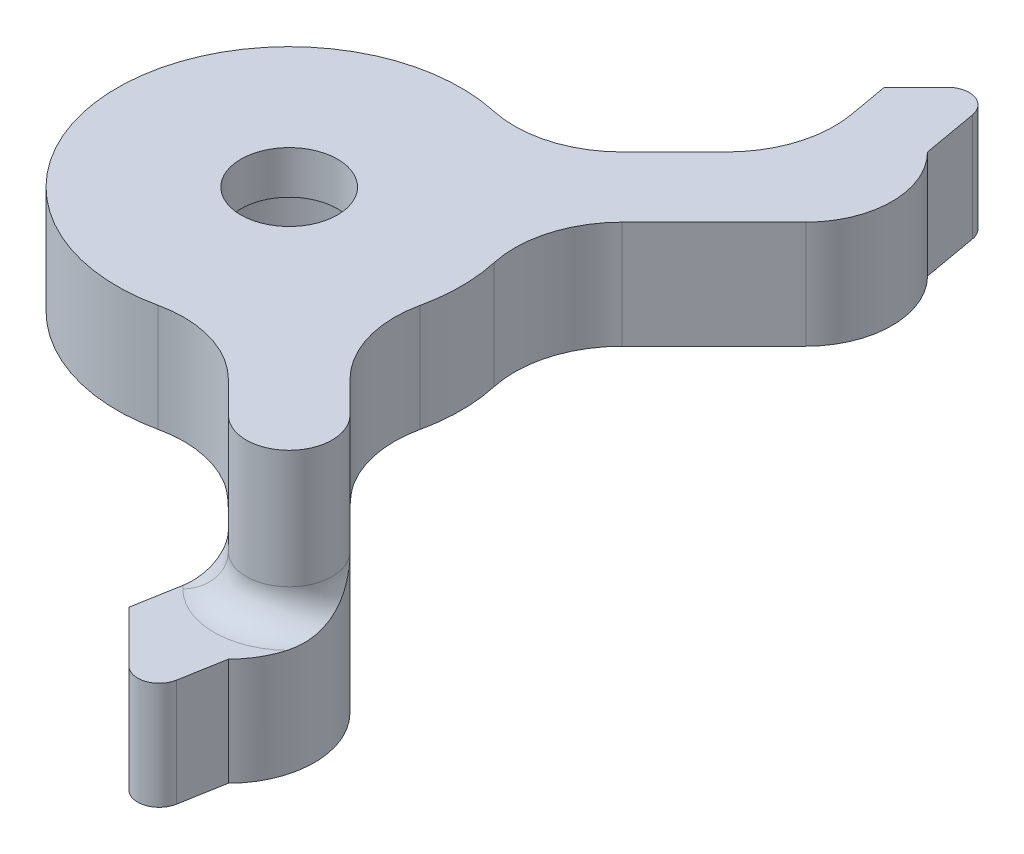
ISO-10303-21;
HEADER;
FILE_DESCRIPTION(('STEP AP214'),'2;1');
FILE_NAME('part.step','',(''),(''),'','','');
FILE_SCHEMA(('AUTOMOTIVE_DESIGN { 1 0 10303 214 1 1 1 1 }'));
ENDSEC;
DATA;
#1=APPLICATION_CONTEXT('core data for automotive mechanical design processes');
#2=APPLICATION_PROTOCOL_DEFINITION('international standard','automotive_design',2000,#1);
#3=PRODUCT_CONTEXT('',#1,'mechanical');
#4=PRODUCT('Part','Part','',(#3));
#5=PRODUCT_RELATED_PRODUCT_CATEGORY('part','',(#4));
#6=PRODUCT_DEFINITION_FORMATION('','',#4);
#7=PRODUCT_DEFINITION_CONTEXT('part definition',#1,'design');
#8=PRODUCT_DEFINITION('design','',#6,#7);
#9=PRODUCT_DEFINITION_SHAPE('','',#8);
#10=(LENGTH_UNIT() NAMED_UNIT(*) SI_UNIT(.MILLI.,.METRE.));
#11=(NAMED_UNIT(*) PLANE_ANGLE_UNIT() SI_UNIT($,.RADIAN.));
#12=(NAMED_UNIT(*) SI_UNIT($,.STERADIAN.) SOLID_ANGLE_UNIT());
#13=UNCERTAINTY_MEASURE_WITH_UNIT(LENGTH_MEASURE(1.E-05),#10,'distance_accuracy_value','');
#14=(GEOMETRIC_REPRESENTATION_CONTEXT(3) GLOBAL_UNCERTAINTY_ASSIGNED_CONTEXT((#13)) GLOBAL_UNIT_ASSIGNED_CONTEXT((#10,
#11,#12)) REPRESENTATION_CONTEXT('',''));
#15=CARTESIAN_POINT('',(0.,0.,0.));
#16=DIRECTION('',(0.,0.,1.));
#17=DIRECTION('',(1.,0.,0.));
#18=AXIS2_PLACEMENT_3D('',#15,#16,#17);
#19=CARTESIAN_POINT('',(0.,5.,0.));
#20=DIRECTION('',(0.,-1.,0.));
#21=DIRECTION('',(0.,0.,-1.));
#22=AXIS2_PLACEMENT_3D('',#19,#20,#21);
#23=CYLINDRICAL_SURFACE('',#22,8.);
#24=CARTESIAN_POINT('',(0.,0.,0.));
#25=DIRECTION('',(0.,1.,0.));
#26=DIRECTION('',(0.,0.,1.));
#27=AXIS2_PLACEMENT_3D('',#24,#25,#26);
#28=CIRCLE('',#27,8.);
#29=CARTESIAN_POINT('',(7.8127471758281,0.,1.7207502917594));
#30=VERTEX_POINT('',#29);
#31=CARTESIAN_POINT('',(7.8127471758281,0.,-1.7207502917594));
#32=VERTEX_POINT('',#31);
#33=EDGE_CURVE('E316',#30,#32,#28,.T.);
#34=ORIENTED_EDGE('',*,*,#33,.T.);
#35=DIRECTION('',(0.,-1.,0.));
#36=VECTOR('',#35,1.);
#37=CARTESIAN_POINT('',(7.8127471758281,5.,-1.7207502917594));
#38=LINE('',#37,#36);
#39=CARTESIAN_POINT('',(7.8127471758281,5.,-1.7207502917594));
#40=VERTEX_POINT('',#39);
#41=EDGE_CURVE('E354',#32,#40,#38,.F.);
#42=ORIENTED_EDGE('',*,*,#41,.T.);
#43=CARTESIAN_POINT('',(0.,5.,0.));
#44=DIRECTION('',(0.,1.,0.));
#45=DIRECTION('',(0.,0.,1.));
#46=AXIS2_PLACEMENT_3D('',#43,#44,#45);
#47=CIRCLE('',#46,8.);
#48=CARTESIAN_POINT('',(7.8127471758281,5.,1.7207502917594));
#49=VERTEX_POINT('',#48);
#50=EDGE_CURVE('E311',#49,#40,#47,.T.);
#51=ORIENTED_EDGE('',*,*,#50,.F.);
#52=DIRECTION('',(0.,-1.,0.));
#53=VECTOR('',#52,1.);
#54=CARTESIAN_POINT('',(7.8127471758281,5.,1.7207502917594));
#55=LINE('',#54,#53);
#56=EDGE_CURVE('E351',#49,#30,#55,.T.);
#57=ORIENTED_EDGE('',*,*,#56,.T.);
#58=EDGE_LOOP('',(#34,#42,#51,#57));
#59=FACE_BOUND('',#58,.T.);
#60=ADVANCED_FACE('F34',(#59),#23,.T.);
#61=CARTESIAN_POINT('',(1.72075029175937,0.,-7.81274717582811));
#62=VERTEX_POINT('',#61);
#63=CARTESIAN_POINT('',(1.72075029175937,0.,7.81274717582811));
#64=VERTEX_POINT('',#63);
#65=EDGE_CURVE('E310',#62,#64,#28,.T.);
#66=ORIENTED_EDGE('',*,*,#65,.T.);
#67=DIRECTION('',(0.,-1.,0.));
#68=VECTOR('',#67,1.);
#69=CARTESIAN_POINT('',(1.72075029175937,5.,7.81274717582811));
#70=LINE('',#69,#68);
#71=CARTESIAN_POINT('',(1.72075029175937,5.,7.81274717582811));
#72=VERTEX_POINT('',#71);
#73=EDGE_CURVE('E349',#64,#72,#70,.F.);
#74=ORIENTED_EDGE('',*,*,#73,.T.);
#75=CARTESIAN_POINT('',(1.72075029175937,5.,-7.81274717582811));
#76=VERTEX_POINT('',#75);
#77=EDGE_CURVE('E315',#76,#72,#47,.T.);
#78=ORIENTED_EDGE('',*,*,#77,.F.);
#79=DIRECTION('',(0.,-1.,0.));
#80=VECTOR('',#79,1.);
#81=CARTESIAN_POINT('',(1.72075029175937,5.,-7.81274717582811));
#82=LINE('',#81,#80);
#83=EDGE_CURVE('E347',#76,#62,#82,.T.);
#84=ORIENTED_EDGE('',*,*,#83,.T.);
#85=EDGE_LOOP('',(#66,#74,#78,#84));
#86=FACE_BOUND('',#85,.T.);
#87=ADVANCED_FACE('F453',(#86),#23,.T.);
#88=CARTESIAN_POINT('',(0.,5.,0.));
#89=DIRECTION('',(0.,-1.,0.));
#90=DIRECTION('',(0.,0.,-1.));
#91=AXIS2_PLACEMENT_3D('',#88,#89,#90);
#92=CYLINDRICAL_SURFACE('',#91,2.25);
#93=CARTESIAN_POINT('',(0.,5.,0.));
#94=DIRECTION('',(0.,1.,0.));
#95=DIRECTION('',(0.,0.,1.));
#96=AXIS2_PLACEMENT_3D('',#93,#94,#95);
#97=CIRCLE('',#96,2.25);
#98=CARTESIAN_POINT('',(0.,5.,2.25));
#99=VERTEX_POINT('',#98);
#100=EDGE_CURVE('E307',#99,#99,#97,.T.);
#101=ORIENTED_EDGE('',*,*,#100,.T.);
#102=EDGE_LOOP('',(#101));
#103=FACE_BOUND('',#102,.T.);
#104=CARTESIAN_POINT('',(0.,3.,0.));
#105=DIRECTION('',(0.,-1.,0.));
#106=DIRECTION('',(0.,0.,-1.));
#107=AXIS2_PLACEMENT_3D('',#104,#105,#106);
#108=CIRCLE('',#107,2.25);
#109=CARTESIAN_POINT('',(0.,3.,-2.25));
#110=VERTEX_POINT('',#109);
#111=EDGE_CURVE('E304',#110,#110,#108,.T.);
#112=ORIENTED_EDGE('',*,*,#111,.T.);
#113=EDGE_LOOP('',(#112));
#114=FACE_BOUND('',#113,.T.);
#115=ADVANCED_FACE('F450',(#103,#114),#92,.F.);
#116=CARTESIAN_POINT('',(0.,5.,0.));
#117=DIRECTION('',(0.,1.,0.));
#118=DIRECTION('',(0.,0.,1.));
#119=AXIS2_PLACEMENT_3D('',#116,#117,#118);
#120=PLANE('',#119);
#121=DIRECTION('',(-0.173648177666935,0.,-0.984807753012207));
#122=VECTOR('',#121,1.);
#123=CARTESIAN_POINT('',(12.6536120430432,5.,-20.6950908558455));
#124=LINE('',#123,#122);
#125=CARTESIAN_POINT('',(13.4350288425444,5.,-16.2634559672906));
#126=VERTEX_POINT('',#125);
#127=CARTESIAN_POINT('',(12.9871870887225,5.,-18.8032927638065));
#128=VERTEX_POINT('',#127);
#129=EDGE_CURVE('E223',#126,#128,#124,.T.);
#130=ORIENTED_EDGE('',*,*,#129,.T.);
#131=CARTESIAN_POINT('',(12.0023793357103,5.,-18.6296445861395));
#132=DIRECTION('',(0.,1.,0.));
#133=DIRECTION('',(0.,0.,1.));
#134=AXIS2_PLACEMENT_3D('',#131,#132,#133);
#135=CIRCLE('',#134,1.);
#136=CARTESIAN_POINT('',(11.2952725545237,5.,-19.3367513673261));
#137=VERTEX_POINT('',#136);
#138=EDGE_CURVE('E532',#128,#137,#135,.T.);
#139=ORIENTED_EDGE('',*,*,#138,.T.);
#140=DIRECTION('',(-0.707106781186545,0.,0.70710678118655));
#141=VECTOR('',#140,1.);
#142=CARTESIAN_POINT('',(9.82518491829698,5.,-17.8666637310994));
#143=LINE('',#142,#141);
#144=CARTESIAN_POINT('',(9.82518491829698,5.,-17.8666637310994));
#145=VERTEX_POINT('',#144);
#146=EDGE_CURVE('E228',#137,#145,#143,.T.);
#147=ORIENTED_EDGE('',*,*,#146,.T.);
#148=DIRECTION('',(0.173648177666935,0.,0.984807753012207));
#149=VECTOR('',#148,1.);
#150=CARTESIAN_POINT('',(10.6066017177982,5.,-13.4350288425444));
#151=LINE('',#150,#149);
#152=CARTESIAN_POINT('',(10.1546241193894,5.,-15.9983211792747));
#153=VERTEX_POINT('',#152);
#154=EDGE_CURVE('E241',#145,#153,#151,.T.);
#155=ORIENTED_EDGE('',*,*,#154,.T.);
#156=CARTESIAN_POINT('',(5.23058535432834,5.,-15.13008029094));
#157=DIRECTION('',(0.,1.,0.));
#158=DIRECTION('',(0.,0.,1.));
#159=AXIS2_PLACEMENT_3D('',#156,#157,#158);
#160=CIRCLE('',#159,5.);
#161=CARTESIAN_POINT('',(8.76611926026108,5.,-11.5945463850073));
#162=VERTEX_POINT('',#161);
#163=EDGE_CURVE('E361',#153,#162,#160,.F.);
#164=ORIENTED_EDGE('',*,*,#163,.T.);
#165=DIRECTION('',(-0.707106781186546,0.,0.707106781186549));
#166=VECTOR('',#165,1.);
#167=CARTESIAN_POINT('',(4.06301201267856,5.,-6.89143913742476));
#168=LINE('',#167,#166);
#169=CARTESIAN_POINT('',(6.33175313004172,5.,-9.16018025478794));
#170=VERTEX_POINT('',#169);
#171=EDGE_CURVE('E244',#162,#170,#168,.T.);
#172=ORIENTED_EDGE('',*,*,#171,.T.);
#173=CARTESIAN_POINT('',(2.79621922410898,5.,-12.6957141607207));
#174=DIRECTION('',(0.,1.,0.));
#175=DIRECTION('',(0.,0.,1.));
#176=AXIS2_PLACEMENT_3D('',#173,#174,#175);
#177=CIRCLE('',#176,5.);
#178=EDGE_CURVE('E490',#170,#76,#177,.F.);
#179=ORIENTED_EDGE('',*,*,#178,.T.);
#180=ORIENTED_EDGE('',*,*,#77,.T.);
#181=CARTESIAN_POINT('',(2.79621922410898,5.,12.6957141607207));
#182=DIRECTION('',(0.,1.,0.));
#183=DIRECTION('',(0.,0.,1.));
#184=AXIS2_PLACEMENT_3D('',#181,#182,#183);
#185=CIRCLE('',#184,5.);
#186=CARTESIAN_POINT('',(6.33175313004172,5.,9.16018025478794));
#187=VERTEX_POINT('',#186);
#188=EDGE_CURVE('E493',#72,#187,#185,.F.);
#189=ORIENTED_EDGE('',*,*,#188,.T.);
#190=DIRECTION('',(0.707106781186547,0.,0.707106781186548));
#191=VECTOR('',#190,1.);
#192=CARTESIAN_POINT('',(10.6066017177982,5.,13.4350288425444));
#193=LINE('',#192,#191);
#194=CARTESIAN_POINT('',(7.778174593052,5.,10.6066017177982));
#195=VERTEX_POINT('',#194);
#196=EDGE_CURVE('E295',#187,#195,#193,.T.);
#197=ORIENTED_EDGE('',*,*,#196,.T.);
#198=CARTESIAN_POINT('',(9.1923881554251,5.,9.19238815542513));
#199=DIRECTION('',(0.,1.,0.));
#200=DIRECTION('',(0.,0.,1.));
#201=AXIS2_PLACEMENT_3D('',#198,#199,#200);
#202=CIRCLE('',#201,2.);
#203=CARTESIAN_POINT('',(10.6066017177982,5.,7.77817459305204));
#204=VERTEX_POINT('',#203);
#205=EDGE_CURVE('E324',#195,#204,#202,.T.);
#206=ORIENTED_EDGE('',*,*,#205,.T.);
#207=DIRECTION('',(-0.707106781186546,0.,-0.707106781186549));
#208=VECTOR('',#207,1.);
#209=CARTESIAN_POINT('',(6.89143913742475,5.,4.06301201267858));
#210=LINE('',#209,#208);
#211=CARTESIAN_POINT('',(9.16018025478792,5.,6.33175313004176));
#212=VERTEX_POINT('',#211);
#213=EDGE_CURVE('E291',#204,#212,#210,.T.);
#214=ORIENTED_EDGE('',*,*,#213,.T.);
#215=CARTESIAN_POINT('',(12.6957141607207,5.,2.79621922410903));
#216=DIRECTION('',(0.,1.,0.));
#217=DIRECTION('',(0.,0.,1.));
#218=AXIS2_PLACEMENT_3D('',#215,#216,#217);
#219=CIRCLE('',#218,5.);
#220=EDGE_CURVE('E409',#212,#49,#219,.F.);
#221=ORIENTED_EDGE('',*,*,#220,.T.);
#222=ORIENTED_EDGE('',*,*,#50,.T.);
#223=CARTESIAN_POINT('',(12.6957141607207,5.,-2.79621922410902));
#224=DIRECTION('',(0.,1.,0.));
#225=DIRECTION('',(0.,0.,1.));
#226=AXIS2_PLACEMENT_3D('',#223,#224,#225);
#227=CIRCLE('',#226,5.);
#228=CARTESIAN_POINT('',(9.16018025478792,5.,-6.33175313004176));
#229=VERTEX_POINT('',#228);
#230=EDGE_CURVE('E487',#40,#229,#227,.F.);
#231=ORIENTED_EDGE('',*,*,#230,.T.);
#232=DIRECTION('',(0.707106781186546,0.,-0.707106781186549));
#233=VECTOR('',#232,1.);
#234=CARTESIAN_POINT('',(6.89143913742475,5.,-4.06301201267858));
#235=LINE('',#234,#233);
#236=CARTESIAN_POINT('',(13.4350288425444,5.,-10.6066017177982));
#237=VERTEX_POINT('',#236);
#238=EDGE_CURVE('E219',#229,#237,#235,.T.);
#239=ORIENTED_EDGE('',*,*,#238,.T.);
#240=CARTESIAN_POINT('',(10.6066017177982,5.,-13.4350288425444));
#241=DIRECTION('',(0.,1.,0.));
#242=DIRECTION('',(0.,0.,1.));
#243=AXIS2_PLACEMENT_3D('',#240,#241,#242);
#244=CIRCLE('',#243,4.);
#245=EDGE_CURVE('E214',#237,#126,#244,.T.);
#246=ORIENTED_EDGE('',*,*,#245,.T.);
#247=EDGE_LOOP('',(#130,#139,#147,#155,#164,#172,#179,#180,#189,#197,#206,#214,#221,#222,#231,
#239,#246));
#248=FACE_BOUND('',#247,.T.);
#249=ORIENTED_EDGE('',*,*,#100,.F.);
#250=EDGE_LOOP('',(#249));
#251=FACE_BOUND('',#250,.T.);
#252=ADVANCED_FACE('F230',(#248,#251),#120,.T.);
#253=CARTESIAN_POINT('',(0.,0.,0.));
#254=DIRECTION('',(0.,1.,0.));
#255=DIRECTION('',(0.,0.,1.));
#256=AXIS2_PLACEMENT_3D('',#253,#254,#255);
#257=PLANE('',#256);
#258=DIRECTION('',(0.707106781186545,0.,-0.70710678118655));
#259=VECTOR('',#258,1.);
#260=CARTESIAN_POINT('',(9.82518491829698,0.,-17.8666637310994));
#261=LINE('',#260,#259);
#262=CARTESIAN_POINT('',(9.82518491829698,0.,-17.8666637310994));
#263=VERTEX_POINT('',#262);
#264=CARTESIAN_POINT('',(11.2952725545237,0.,-19.3367513673261));
#265=VERTEX_POINT('',#264);
#266=EDGE_CURVE('E250',#263,#265,#261,.T.);
#267=ORIENTED_EDGE('',*,*,#266,.T.);
#268=CARTESIAN_POINT('',(12.0023793357103,0.,-18.6296445861395));
#269=DIRECTION('',(0.,1.,0.));
#270=DIRECTION('',(0.,0.,1.));
#271=AXIS2_PLACEMENT_3D('',#268,#269,#270);
#272=CIRCLE('',#271,1.);
#273=CARTESIAN_POINT('',(12.9871870887225,0.,-18.8032927638065));
#274=VERTEX_POINT('',#273);
#275=EDGE_CURVE('E538',#265,#274,#272,.F.);
#276=ORIENTED_EDGE('',*,*,#275,.T.);
#277=DIRECTION('',(0.173648177666935,0.,0.984807753012207));
#278=VECTOR('',#277,1.);
#279=CARTESIAN_POINT('',(12.6536120430432,0.,-20.6950908558455));
#280=LINE('',#279,#278);
#281=CARTESIAN_POINT('',(13.4350288425444,0.,-16.2634559672906));
#282=VERTEX_POINT('',#281);
#283=EDGE_CURVE('E253',#274,#282,#280,.T.);
#284=ORIENTED_EDGE('',*,*,#283,.T.);
#285=CARTESIAN_POINT('',(10.6066017177982,0.,-13.4350288425444));
#286=DIRECTION('',(0.,1.,0.));
#287=DIRECTION('',(0.,0.,1.));
#288=AXIS2_PLACEMENT_3D('',#285,#286,#287);
#289=CIRCLE('',#288,4.);
#290=CARTESIAN_POINT('',(13.4350288425444,0.,-10.6066017177982));
#291=VERTEX_POINT('',#290);
#292=EDGE_CURVE('E215',#282,#291,#289,.F.);
#293=ORIENTED_EDGE('',*,*,#292,.T.);
#294=DIRECTION('',(-0.707106781186546,0.,0.707106781186549));
#295=VECTOR('',#294,1.);
#296=CARTESIAN_POINT('',(6.89143913742475,0.,-4.06301201267858));
#297=LINE('',#296,#295);
#298=CARTESIAN_POINT('',(9.16018025478792,0.,-6.33175313004176));
#299=VERTEX_POINT('',#298);
#300=EDGE_CURVE('E773',#291,#299,#297,.T.);
#301=ORIENTED_EDGE('',*,*,#300,.T.);
#302=CARTESIAN_POINT('',(12.6957141607207,0.,-2.79621922410902));
#303=DIRECTION('',(0.,1.,0.));
#304=DIRECTION('',(0.,0.,1.));
#305=AXIS2_PLACEMENT_3D('',#302,#303,#304);
#306=CIRCLE('',#305,5.);
#307=EDGE_CURVE('E486',#299,#32,#306,.T.);
#308=ORIENTED_EDGE('',*,*,#307,.T.);
#309=ORIENTED_EDGE('',*,*,#33,.F.);
#310=CARTESIAN_POINT('',(12.6957141607207,0.,2.79621922410903));
#311=DIRECTION('',(0.,1.,0.));
#312=DIRECTION('',(0.,0.,1.));
#313=AXIS2_PLACEMENT_3D('',#310,#311,#312);
#314=CIRCLE('',#313,5.);
#315=CARTESIAN_POINT('',(8.41261778387875,0.,5.37596444925892));
#316=VERTEX_POINT('',#315);
#317=EDGE_CURVE('E410',#30,#316,#314,.T.);
#318=ORIENTED_EDGE('',*,*,#317,.T.);
#319=DIRECTION('',(-0.707106781186548,0.,0.707106781186548));
#320=VECTOR('',#319,1.);
#321=CARTESIAN_POINT('',(6.89429111656883,0.,6.89429111656883));
#322=LINE('',#321,#320);
#323=CARTESIAN_POINT('',(5.37596444925889,0.,8.41261778387877));
#324=VERTEX_POINT('',#323);
#325=EDGE_CURVE('E326',#316,#324,#322,.T.);
#326=ORIENTED_EDGE('',*,*,#325,.T.);
#327=CARTESIAN_POINT('',(2.79621922410898,0.,12.6957141607207));
#328=DIRECTION('',(0.,1.,0.));
#329=DIRECTION('',(0.,0.,1.));
#330=AXIS2_PLACEMENT_3D('',#327,#328,#329);
#331=CIRCLE('',#330,5.);
#332=EDGE_CURVE('E373',#324,#64,#331,.T.);
#333=ORIENTED_EDGE('',*,*,#332,.T.);
#334=ORIENTED_EDGE('',*,*,#65,.F.);
#335=CARTESIAN_POINT('',(2.79621922410898,0.,-12.6957141607207));
#336=DIRECTION('',(0.,1.,0.));
#337=DIRECTION('',(0.,0.,1.));
#338=AXIS2_PLACEMENT_3D('',#335,#336,#337);
#339=CIRCLE('',#338,5.);
#340=CARTESIAN_POINT('',(6.33175313004172,0.,-9.16018025478794));
#341=VERTEX_POINT('',#340);
#342=EDGE_CURVE('E488',#62,#341,#339,.T.);
#343=ORIENTED_EDGE('',*,*,#342,.T.);
#344=DIRECTION('',(0.707106781186546,0.,-0.707106781186549));
#345=VECTOR('',#344,1.);
#346=CARTESIAN_POINT('',(4.06301201267856,0.,-6.89143913742476));
#347=LINE('',#346,#345);
#348=CARTESIAN_POINT('',(8.76611926026108,0.,-11.5945463850073));
#349=VERTEX_POINT('',#348);
#350=EDGE_CURVE('E774',#341,#349,#347,.T.);
#351=ORIENTED_EDGE('',*,*,#350,.T.);
#352=CARTESIAN_POINT('',(5.23058535432834,0.,-15.13008029094));
#353=DIRECTION('',(0.,1.,0.));
#354=DIRECTION('',(0.,0.,1.));
#355=AXIS2_PLACEMENT_3D('',#352,#353,#354);
#356=CIRCLE('',#355,5.);
#357=CARTESIAN_POINT('',(10.1546241193894,0.,-15.9983211792747));
#358=VERTEX_POINT('',#357);
#359=EDGE_CURVE('E363',#349,#358,#356,.T.);
#360=ORIENTED_EDGE('',*,*,#359,.T.);
#361=DIRECTION('',(-0.173648177666935,0.,-0.984807753012207));
#362=VECTOR('',#361,1.);
#363=CARTESIAN_POINT('',(10.6066017177982,0.,-13.4350288425444));
#364=LINE('',#363,#362);
#365=EDGE_CURVE('E776',#358,#263,#364,.T.);
#366=ORIENTED_EDGE('',*,*,#365,.T.);
#367=EDGE_LOOP('',(#267,#276,#284,#293,#301,#308,#309,#318,#326,#333,#334,#343,#351,#360,#366));
#368=FACE_BOUND('',#367,.T.);
#369=CARTESIAN_POINT('',(0.,0.,0.));
#370=DIRECTION('',(0.,-1.,0.));
#371=DIRECTION('',(0.,0.,-1.));
#372=AXIS2_PLACEMENT_3D('',#369,#370,#371);
#373=CIRCLE('',#372,4.75);
#374=CARTESIAN_POINT('',(0.,0.,-4.75));
#375=VERTEX_POINT('',#374);
#376=EDGE_CURVE('E294',#375,#375,#373,.T.);
#377=ORIENTED_EDGE('',*,*,#376,.F.);
#378=EDGE_LOOP('',(#377));
#379=FACE_BOUND('',#378,.T.);
#380=ADVANCED_FACE('F448',(#368,#379),#257,.F.);
#381=CARTESIAN_POINT('',(0.,3.,0.));
#382=DIRECTION('',(0.,-1.,0.));
#383=DIRECTION('',(0.,0.,-1.));
#384=AXIS2_PLACEMENT_3D('',#381,#382,#383);
#385=CYLINDRICAL_SURFACE('',#384,4.75);
#386=CARTESIAN_POINT('',(0.,3.,0.));
#387=DIRECTION('',(0.,-1.,0.));
#388=DIRECTION('',(0.,0.,-1.));
#389=AXIS2_PLACEMENT_3D('',#386,#387,#388);
#390=CIRCLE('',#389,4.75);
#391=CARTESIAN_POINT('',(0.,3.,-4.75));
#392=VERTEX_POINT('',#391);
#393=EDGE_CURVE('E301',#392,#392,#390,.T.);
#394=ORIENTED_EDGE('',*,*,#393,.F.);
#395=EDGE_LOOP('',(#394));
#396=FACE_BOUND('',#395,.T.);
#397=ORIENTED_EDGE('',*,*,#376,.T.);
#398=EDGE_LOOP('',(#397));
#399=FACE_BOUND('',#398,.T.);
#400=ADVANCED_FACE('F444',(#396,#399),#385,.F.);
#401=CARTESIAN_POINT('',(0.,3.,0.));
#402=DIRECTION('',(0.,-1.,0.));
#403=DIRECTION('',(0.,0.,-1.));
#404=AXIS2_PLACEMENT_3D('',#401,#402,#403);
#405=PLANE('',#404);
#406=ORIENTED_EDGE('',*,*,#111,.F.);
#407=EDGE_LOOP('',(#406));
#408=FACE_BOUND('',#407,.T.);
#409=ORIENTED_EDGE('',*,*,#393,.T.);
#410=EDGE_LOOP('',(#409));
#411=FACE_BOUND('',#410,.T.);
#412=ADVANCED_FACE('F439',(#408,#411),#405,.T.);
#413=CARTESIAN_POINT('',(7.778174593052,17.1391281853716,10.6066017177982));
#414=DIRECTION('',(0.,-1.,0.));
#415=DIRECTION('',(0.,0.,-1.));
#416=AXIS2_PLACEMENT_3D('',#413,#414,#415);
#417=CYLINDRICAL_SURFACE('',#416,4.);
#418=DIRECTION('',(0.,-1.,0.));
#419=VECTOR('',#418,1.);
#420=CARTESIAN_POINT('',(10.6066017177982,17.1391281853716,7.77817459305204));
#421=LINE('',#420,#419);
#422=CARTESIAN_POINT('',(10.6066017177982,-0.5,7.77817459305204));
#423=VERTEX_POINT('',#422);
#424=CARTESIAN_POINT('',(10.6066017177982,-7.,7.77817459305204));
#425=VERTEX_POINT('',#424);
#426=EDGE_CURVE('E288',#423,#425,#421,.T.);
#427=ORIENTED_EDGE('',*,*,#426,.F.);
#428=CARTESIAN_POINT('',(11.6226730934546,-2.,11.7110614411029));
#429=CARTESIAN_POINT('',(11.6486441252107,-2.00000267770468,11.6207152147233));
#430=CARTESIAN_POINT('',(11.6713991840635,-1.99779177912829,11.5294510419373));
#431=CARTESIAN_POINT('',(11.7104011716728,-1.98894483401129,11.3457734541467));
#432=CARTESIAN_POINT('',(11.7266494599698,-1.9823097126515,11.2533602833814));
#433=CARTESIAN_POINT('',(11.7525245386762,-1.96464915776754,11.0683769043633));
#434=CARTESIAN_POINT('',(11.7621756785095,-1.9536401086199,10.9758085516515));
#435=CARTESIAN_POINT('',(11.7750049624615,-1.92727870955472,10.7908651084736));
#436=CARTESIAN_POINT('',(11.7781830093897,-1.91192629442754,10.69849002093));
#437=CARTESIAN_POINT('',(11.7781576914795,-1.8592743672507,10.421775398816));
#438=CARTESIAN_POINT('',(11.7652983223399,-1.81544730742859,10.2385537484908));
#439=CARTESIAN_POINT('',(11.7158315265978,-1.71163391318454,9.88018564707724));
#440=CARTESIAN_POINT('',(11.6792131206516,-1.65164011541164,9.70504296948075));
#441=CARTESIAN_POINT('',(11.581941348397,-1.51300538893712,9.35499718469913));
#442=CARTESIAN_POINT('',(11.5198519957565,-1.43338995782777,9.18088403914303));
#443=CARTESIAN_POINT('',(11.3754616838472,-1.26135459069883,8.84804549049692));
#444=CARTESIAN_POINT('',(11.2931442819692,-1.16892426471098,8.6893327529442));
#445=CARTESIAN_POINT('',(11.1181378613224,-0.982827261767018,8.39954421131512));
#446=CARTESIAN_POINT('',(11.0267132428737,-0.889788887399947,8.26728461898476));
#447=CARTESIAN_POINT('',(10.8304222958683,-0.700023508457111,8.01640652821223));
#448=CARTESIAN_POINT('',(10.7255746636668,-0.60330176350413,7.89776948341671));
#449=CARTESIAN_POINT('',(10.6116833730839,-0.504403823435182,7.78326312441447));
#450=CARTESIAN_POINT('',(10.6091442312458,-0.502201893645233,7.78071712692864));
#451=CARTESIAN_POINT('',(10.6066017177982,-0.5,7.77817459305204));
#452=B_SPLINE_CURVE_WITH_KNOTS('',3,(#428,#429,#430,#431,#432,#433,#434,#435,#436,#437,#438,
#439,#440,#441,#442,#443,#444,#445,#446,#447,#448,#449,#450,#451),.UNSPECIFIED.,.F.,.F.,(4,2,2,
2,2,2,2,2,2,2,2,4),(0.,0.281920042750281,0.563781149669452,0.844596234951831,1.12541553650847,
1.68917863645205,2.25320244399891,2.8547219810872,3.45673209731658,4.01297123887842,
4.56844387990341,4.58109299890721),.UNSPECIFIED.);
#453=CARTESIAN_POINT('',(11.6226730934546,-2.,11.7110614411029));
#454=VERTEX_POINT('',#453);
#455=EDGE_CURVE('E426',#423,#454,#452,.F.);
#456=ORIENTED_EDGE('',*,*,#455,.T.);
#457=CARTESIAN_POINT('',(7.778174593052,-2.,10.6066017177982));
#458=DIRECTION('',(0.,1.,0.));
#459=DIRECTION('',(0.,0.,1.));
#460=AXIS2_PLACEMENT_3D('',#457,#458,#459);
#461=CIRCLE('',#460,4.);
#462=CARTESIAN_POINT('',(10.6066017177982,-2.,13.4350288425444));
#463=VERTEX_POINT('',#462);
#464=EDGE_CURVE('E314',#454,#463,#461,.F.);
#465=ORIENTED_EDGE('',*,*,#464,.T.);
#466=DIRECTION('',(0.,-1.,0.));
#467=VECTOR('',#466,1.);
#468=CARTESIAN_POINT('',(10.6066017177982,-2.,13.4350288425444));
#469=LINE('',#468,#467);
#470=CARTESIAN_POINT('',(10.6066017177982,-7.,13.4350288425444));
#471=VERTEX_POINT('',#470);
#472=EDGE_CURVE('E265',#463,#471,#469,.T.);
#473=ORIENTED_EDGE('',*,*,#472,.T.);
#474=CARTESIAN_POINT('',(7.778174593052,-7.,10.6066017177982));
#475=DIRECTION('',(0.,1.,0.));
#476=DIRECTION('',(0.,0.,1.));
#477=AXIS2_PLACEMENT_3D('',#474,#475,#476);
#478=CIRCLE('',#477,4.);
#479=EDGE_CURVE('E274',#471,#425,#478,.T.);
#480=ORIENTED_EDGE('',*,*,#479,.T.);
#481=EDGE_LOOP('',(#427,#456,#465,#473,#480));
#482=FACE_BOUND('',#481,.T.);
#483=ADVANCED_FACE('F433',(#482),#417,.T.);
#484=CARTESIAN_POINT('',(6.89143913742475,17.1391281853716,4.06301201267858));
#485=DIRECTION('',(-0.707106781186549,0.,0.707106781186546));
#486=DIRECTION('',(0.707106781186546,0.,0.707106781186549));
#487=AXIS2_PLACEMENT_3D('',#484,#485,#486);
#488=PLANE('',#487);
#489=CARTESIAN_POINT('',(8.30850467894192,-2.,5.48007755419575));
#490=DIRECTION('',(-0.707106781186549,0.,0.707106781186546));
#491=DIRECTION('',(0.707106781186546,0.,0.707106781186549));
#492=AXIS2_PLACEMENT_3D('',#489,#490,#491);
#493=CIRCLE('',#492,2.);
#494=CARTESIAN_POINT('',(9.72271824131501,-2.,6.89429111656885));
#495=VERTEX_POINT('',#494);
#496=CARTESIAN_POINT('',(9.16018025478792,-0.403348057022208,6.33175313004176));
#497=VERTEX_POINT('',#496);
#498=EDGE_CURVE('E333',#495,#497,#493,.T.);
#499=ORIENTED_EDGE('',*,*,#498,.T.);
#500=DIRECTION('',(0.,1.,0.));
#501=VECTOR('',#500,1.);
#502=CARTESIAN_POINT('',(9.16018025478792,5.,6.33175313004176));
#503=LINE('',#502,#501);
#504=EDGE_CURVE('E359',#497,#212,#503,.T.);
#505=ORIENTED_EDGE('',*,*,#504,.T.);
#506=ORIENTED_EDGE('',*,*,#213,.F.);
#507=EDGE_CURVE('E298',#204,#423,#421,.T.);
#508=ORIENTED_EDGE('',*,*,#507,.T.);
#509=ORIENTED_EDGE('',*,*,#426,.T.);
#510=DIRECTION('',(-0.707106781186547,0.,-0.707106781186548));
#511=VECTOR('',#510,1.);
#512=CARTESIAN_POINT('',(10.6066017177982,-7.,7.77817459305204));
#513=LINE('',#512,#511);
#514=CARTESIAN_POINT('',(9.72271824131501,-7.,6.89429111656885));
#515=VERTEX_POINT('',#514);
#516=EDGE_CURVE('E279',#425,#515,#513,.T.);
#517=ORIENTED_EDGE('',*,*,#516,.T.);
#518=DIRECTION('',(0.,1.,0.));
#519=VECTOR('',#518,1.);
#520=CARTESIAN_POINT('',(9.72271824131501,-7.,6.89429111656885));
#521=LINE('',#520,#519);
#522=EDGE_CURVE('E284',#515,#495,#521,.T.);
#523=ORIENTED_EDGE('',*,*,#522,.T.);
#524=EDGE_LOOP('',(#499,#505,#506,#508,#509,#517,#523));
#525=FACE_BOUND('',#524,.T.);
#526=ADVANCED_FACE('F438',(#525),#488,.F.);
#527=CARTESIAN_POINT('',(10.6066017177982,17.1391281853716,13.4350288425444));
#528=DIRECTION('',(0.707106781186548,0.,-0.707106781186547));
#529=DIRECTION('',(-0.707106781186547,0.,-0.707106781186548));
#530=AXIS2_PLACEMENT_3D('',#527,#528,#529);
#531=PLANE('',#530);
#532=DIRECTION('',(0.,1.,0.));
#533=VECTOR('',#532,1.);
#534=CARTESIAN_POINT('',(6.89429111656883,17.1391281853716,9.72271824131505));
#535=LINE('',#534,#533);
#536=CARTESIAN_POINT('',(6.89429111656882,-2.,9.72271824131504));
#537=VERTEX_POINT('',#536);
#538=CARTESIAN_POINT('',(6.89429111656883,-0.5,9.72271824131505));
#539=VERTEX_POINT('',#538);
#540=EDGE_CURVE('E421',#537,#539,#535,.T.);
#541=ORIENTED_EDGE('',*,*,#540,.T.);
#542=DIRECTION('',(0.707106781186547,0.,0.707106781186548));
#543=VECTOR('',#542,1.);
#544=CARTESIAN_POINT('',(10.6066017177982,-0.5,13.4350288425444));
#545=LINE('',#544,#543);
#546=CARTESIAN_POINT('',(7.778174593052,-0.5,10.6066017177982));
#547=VERTEX_POINT('',#546);
#548=EDGE_CURVE('E424',#539,#547,#545,.T.);
#549=ORIENTED_EDGE('',*,*,#548,.T.);
#550=DIRECTION('',(0.,-1.,0.));
#551=VECTOR('',#550,1.);
#552=CARTESIAN_POINT('',(7.778174593052,17.1391281853716,10.6066017177982));
#553=LINE('',#552,#551);
#554=EDGE_CURVE('E322',#547,#195,#553,.F.);
#555=ORIENTED_EDGE('',*,*,#554,.T.);
#556=ORIENTED_EDGE('',*,*,#196,.F.);
#557=DIRECTION('',(0.,1.,0.));
#558=VECTOR('',#557,1.);
#559=CARTESIAN_POINT('',(6.33175313004172,0.,9.16018025478794));
#560=LINE('',#559,#558);
#561=CARTESIAN_POINT('',(6.33175313004172,-0.403348057022197,9.16018025478794));
#562=VERTEX_POINT('',#561);
#563=EDGE_CURVE('E344',#187,#562,#560,.F.);
#564=ORIENTED_EDGE('',*,*,#563,.T.);
#565=CARTESIAN_POINT('',(5.48007755419572,-2.,8.30850467894195));
#566=DIRECTION('',(0.707106781186548,0.,-0.707106781186547));
#567=DIRECTION('',(-0.707106781186547,0.,-0.707106781186548));
#568=AXIS2_PLACEMENT_3D('',#565,#566,#567);
#569=CIRCLE('',#568,2.);
#570=EDGE_CURVE('E330',#562,#537,#569,.T.);
#571=ORIENTED_EDGE('',*,*,#570,.T.);
#572=EDGE_LOOP('',(#541,#549,#555,#556,#564,#571));
#573=FACE_BOUND('',#572,.T.);
#574=ADVANCED_FACE('F509',(#573),#531,.F.);
#575=CARTESIAN_POINT('',(9.72271824131501,-7.,6.89429111656885));
#576=DIRECTION('',(-0.707106781186547,0.,-0.707106781186547));
#577=DIRECTION('',(-0.707106781186548,0.,0.707106781186548));
#578=AXIS2_PLACEMENT_3D('',#575,#576,#577);
#579=PLANE('',#578);
#580=DIRECTION('',(0.,1.,0.));
#581=VECTOR('',#580,1.);
#582=CARTESIAN_POINT('',(6.89429111656882,-7.,9.72271824131504));
#583=LINE('',#582,#581);
#584=CARTESIAN_POINT('',(6.89429111656882,-7.,9.72271824131504));
#585=VERTEX_POINT('',#584);
#586=EDGE_CURVE('E285',#585,#537,#583,.T.);
#587=ORIENTED_EDGE('',*,*,#586,.T.);
#588=DIRECTION('',(-0.707106781186548,0.,0.707106781186548));
#589=VECTOR('',#588,1.);
#590=CARTESIAN_POINT('',(9.72271824131501,-2.,6.89429111656885));
#591=LINE('',#590,#589);
#592=EDGE_CURVE('E328',#537,#495,#591,.F.);
#593=ORIENTED_EDGE('',*,*,#592,.T.);
#594=ORIENTED_EDGE('',*,*,#522,.F.);
#595=DIRECTION('',(-0.707106781186548,0.,0.707106781186548));
#596=VECTOR('',#595,1.);
#597=CARTESIAN_POINT('',(9.72271824131501,-7.,6.89429111656885));
#598=LINE('',#597,#596);
#599=EDGE_CURVE('E282',#515,#585,#598,.T.);
#600=ORIENTED_EDGE('',*,*,#599,.T.);
#601=EDGE_LOOP('',(#587,#593,#594,#600));
#602=FACE_BOUND('',#601,.T.);
#603=ADVANCED_FACE('F514',(#602),#579,.T.);
#604=CARTESIAN_POINT('',(7.778174593052,-7.,10.6066017177982));
#605=DIRECTION('',(0.,1.,0.));
#606=DIRECTION('',(0.,0.,1.));
#607=AXIS2_PLACEMENT_3D('',#604,#605,#606);
#608=PLANE('',#607);
#609=DIRECTION('',(-0.173648177666933,0.,0.984807753012208));
#610=VECTOR('',#609,1.);
#611=CARTESIAN_POINT('',(9.91200900713046,-7.,17.3742598545933));
#612=LINE('',#611,#610);
#613=CARTESIAN_POINT('',(10.2455840528097,-7.,15.4824617625542));
#614=VERTEX_POINT('',#613);
#615=EDGE_CURVE('E255',#471,#614,#612,.T.);
#616=ORIENTED_EDGE('',*,*,#615,.T.);
#617=CARTESIAN_POINT('',(9.26077629979754,-7.,15.3088135848872));
#618=DIRECTION('',(0.,1.,0.));
#619=DIRECTION('',(0.,0.,1.));
#620=AXIS2_PLACEMENT_3D('',#617,#618,#619);
#621=CIRCLE('',#620,1.);
#622=CARTESIAN_POINT('',(8.55366951861099,-7.,16.0159203660738));
#623=VERTEX_POINT('',#622);
#624=EDGE_CURVE('E56',#614,#623,#621,.F.);
#625=ORIENTED_EDGE('',*,*,#624,.T.);
#626=DIRECTION('',(-0.707106781186547,0.,-0.707106781186548));
#627=VECTOR('',#626,1.);
#628=CARTESIAN_POINT('',(6.19969840590109,-7.,13.6619492533639));
#629=LINE('',#628,#627);
#630=CARTESIAN_POINT('',(6.19969840590109,-7.,13.6619492533639));
#631=VERTEX_POINT('',#630);
#632=EDGE_CURVE('E267',#623,#631,#629,.T.);
#633=ORIENTED_EDGE('',*,*,#632,.T.);
#634=DIRECTION('',(0.173648177666933,0.,-0.984807753012208));
#635=VECTOR('',#634,1.);
#636=CARTESIAN_POINT('',(6.89429111656883,-7.,9.72271824131503));
#637=LINE('',#636,#635);
#638=EDGE_CURVE('E260',#631,#585,#637,.T.);
#639=ORIENTED_EDGE('',*,*,#638,.T.);
#640=ORIENTED_EDGE('',*,*,#599,.F.);
#641=ORIENTED_EDGE('',*,*,#516,.F.);
#642=ORIENTED_EDGE('',*,*,#479,.F.);
#643=EDGE_LOOP('',(#616,#625,#633,#639,#640,#641,#642));
#644=FACE_BOUND('',#643,.T.);
#645=ADVANCED_FACE('F520',(#644),#608,.F.);
#646=CARTESIAN_POINT('',(6.89429111656883,-2.,9.72271824131503));
#647=DIRECTION('',(-0.984807753012208,0.,-0.173648177666933));
#648=DIRECTION('',(-0.173648177666933,0.,0.984807753012208));
#649=AXIS2_PLACEMENT_3D('',#646,#647,#648);
#650=PLANE('',#649);
#651=ORIENTED_EDGE('',*,*,#638,.F.);
#652=DIRECTION('',(0.,-1.,0.));
#653=VECTOR('',#652,1.);
#654=CARTESIAN_POINT('',(6.19969840590109,-2.,13.6619492533639));
#655=LINE('',#654,#653);
#656=CARTESIAN_POINT('',(6.19969840590109,-2.,13.6619492533639));
#657=VERTEX_POINT('',#656);
#658=EDGE_CURVE('E271',#657,#631,#655,.T.);
#659=ORIENTED_EDGE('',*,*,#658,.F.);
#660=DIRECTION('',(0.173648177666933,0.,-0.984807753012208));
#661=VECTOR('',#660,1.);
#662=CARTESIAN_POINT('',(6.89429111656883,-2.,9.72271824131503));
#663=LINE('',#662,#661);
#664=CARTESIAN_POINT('',(6.57631319254804,-2.,11.5260606608539));
#665=VERTEX_POINT('',#664);
#666=EDGE_CURVE('E262',#657,#665,#663,.T.);
#667=ORIENTED_EDGE('',*,*,#666,.T.);
#668=CARTESIAN_POINT('',(6.57631319254804,-0.5,11.5260606608539));
#669=DIRECTION('',(-0.984807753012208,0.,-0.173648177666933));
#670=DIRECTION('',(-0.173648177666933,0.,0.984807753012208));
#671=AXIS2_PLACEMENT_3D('',#668,#669,#670);
#672=ELLIPSE('',#671,1.83116188314218,1.5);
#673=EDGE_CURVE('E432',#665,#539,#672,.F.);
#674=ORIENTED_EDGE('',*,*,#673,.T.);
#675=ORIENTED_EDGE('',*,*,#540,.F.);
#676=ORIENTED_EDGE('',*,*,#586,.F.);
#677=EDGE_LOOP('',(#651,#659,#667,#674,#675,#676));
#678=FACE_BOUND('',#677,.T.);
#679=ADVANCED_FACE('F518',(#678),#650,.T.);
#680=CARTESIAN_POINT('',(6.19969840590109,-2.,13.6619492533639));
#681=DIRECTION('',(-0.707106781186548,0.,0.707106781186547));
#682=DIRECTION('',(0.707106781186547,0.,0.707106781186548));
#683=AXIS2_PLACEMENT_3D('',#680,#681,#682);
#684=PLANE('',#683);
#685=ORIENTED_EDGE('',*,*,#632,.F.);
#686=DIRECTION('',(0.,-1.,0.));
#687=VECTOR('',#686,1.);
#688=CARTESIAN_POINT('',(8.55366951861099,-2.,16.0159203660738));
#689=LINE('',#688,#687);
#690=CARTESIAN_POINT('',(8.55366951861099,-2.,16.0159203660738));
#691=VERTEX_POINT('',#690);
#692=EDGE_CURVE('E42',#623,#691,#689,.F.);
#693=ORIENTED_EDGE('',*,*,#692,.T.);
#694=DIRECTION('',(-0.707106781186547,0.,-0.707106781186548));
#695=VECTOR('',#694,1.);
#696=CARTESIAN_POINT('',(6.19969840590109,-2.,13.6619492533639));
#697=LINE('',#696,#695);
#698=EDGE_CURVE('E259',#691,#657,#697,.T.);
#699=ORIENTED_EDGE('',*,*,#698,.T.);
#700=ORIENTED_EDGE('',*,*,#658,.T.);
#701=EDGE_LOOP('',(#685,#693,#699,#700));
#702=FACE_BOUND('',#701,.T.);
#703=ADVANCED_FACE('F522',(#702),#684,.T.);
#704=CARTESIAN_POINT('',(9.91200900713046,-2.,17.3742598545933));
#705=DIRECTION('',(0.984807753012208,0.,0.173648177666933));
#706=DIRECTION('',(0.173648177666933,0.,-0.984807753012208));
#707=AXIS2_PLACEMENT_3D('',#704,#705,#706);
#708=PLANE('',#707);
#709=DIRECTION('',(-0.173648177666933,0.,0.984807753012208));
#710=VECTOR('',#709,1.);
#711=CARTESIAN_POINT('',(9.91200900713046,-2.,17.3742598545933));
#712=LINE('',#711,#710);
#713=CARTESIAN_POINT('',(10.2455840528097,-2.,15.4824617625542));
#714=VERTEX_POINT('',#713);
#715=EDGE_CURVE('E256',#463,#714,#712,.T.);
#716=ORIENTED_EDGE('',*,*,#715,.T.);
#717=DIRECTION('',(0.,-1.,0.));
#718=VECTOR('',#717,1.);
#719=CARTESIAN_POINT('',(10.2455840528097,-2.,15.4824617625542));
#720=LINE('',#719,#718);
#721=EDGE_CURVE('E540',#714,#614,#720,.T.);
#722=ORIENTED_EDGE('',*,*,#721,.T.);
#723=ORIENTED_EDGE('',*,*,#615,.F.);
#724=ORIENTED_EDGE('',*,*,#472,.F.);
#725=EDGE_LOOP('',(#716,#722,#723,#724));
#726=FACE_BOUND('',#725,.T.);
#727=ADVANCED_FACE('F471',(#726),#708,.T.);
#728=CARTESIAN_POINT('',(0.,-2.,0.));
#729=DIRECTION('',(0.,1.,0.));
#730=DIRECTION('',(0.,0.,1.));
#731=AXIS2_PLACEMENT_3D('',#728,#729,#730);
#732=PLANE('',#731);
#733=ORIENTED_EDGE('',*,*,#698,.F.);
#734=CARTESIAN_POINT('',(9.26077629979754,-2.,15.3088135848872));
#735=DIRECTION('',(0.,1.,0.));
#736=DIRECTION('',(0.,0.,1.));
#737=AXIS2_PLACEMENT_3D('',#734,#735,#736);
#738=CIRCLE('',#737,1.);
#739=EDGE_CURVE('E11',#691,#714,#738,.T.);
#740=ORIENTED_EDGE('',*,*,#739,.T.);
#741=ORIENTED_EDGE('',*,*,#715,.F.);
#742=ORIENTED_EDGE('',*,*,#464,.F.);
#743=CARTESIAN_POINT('',(9.1923881554251,-2.,9.19238815542513));
#744=DIRECTION('',(0.,1.,0.));
#745=DIRECTION('',(0.,0.,1.));
#746=AXIS2_PLACEMENT_3D('',#743,#744,#745);
#747=CIRCLE('',#746,3.5);
#748=CARTESIAN_POINT('',(6.71751442127218,-2.,11.667261889578));
#749=VERTEX_POINT('',#748);
#750=EDGE_CURVE('E415',#454,#749,#747,.F.);
#751=ORIENTED_EDGE('',*,*,#750,.T.);
#752=DIRECTION('',(0.707106781186547,0.,0.707106781186548));
#753=VECTOR('',#752,1.);
#754=CARTESIAN_POINT('',(-2.47487373415293,-2.,2.47487373415292));
#755=LINE('',#754,#753);
#756=EDGE_CURVE('E413',#749,#665,#755,.F.);
#757=ORIENTED_EDGE('',*,*,#756,.T.);
#758=ORIENTED_EDGE('',*,*,#666,.F.);
#759=EDGE_LOOP('',(#733,#740,#741,#742,#751,#757,#758));
#760=FACE_BOUND('',#759,.T.);
#761=ADVANCED_FACE('F464',(#760),#732,.T.);
#762=CARTESIAN_POINT('',(9.1923881554251,17.1391281853716,9.19238815542513));
#763=DIRECTION('',(0.,-1.,0.));
#764=DIRECTION('',(0.,0.,-1.));
#765=AXIS2_PLACEMENT_3D('',#762,#763,#764);
#766=CYLINDRICAL_SURFACE('',#765,2.);
#767=ORIENTED_EDGE('',*,*,#554,.F.);
#768=CARTESIAN_POINT('',(9.1923881554251,-0.5,9.19238815542513));
#769=DIRECTION('',(0.,1.,0.));
#770=DIRECTION('',(0.,0.,1.));
#771=AXIS2_PLACEMENT_3D('',#768,#769,#770);
#772=CIRCLE('',#771,2.);
#773=EDGE_CURVE('E418',#547,#423,#772,.T.);
#774=ORIENTED_EDGE('',*,*,#773,.T.);
#775=ORIENTED_EDGE('',*,*,#507,.F.);
#776=ORIENTED_EDGE('',*,*,#205,.F.);
#777=EDGE_LOOP('',(#767,#774,#775,#776));
#778=FACE_BOUND('',#777,.T.);
#779=ADVANCED_FACE('F462',(#778),#766,.T.);
#780=CARTESIAN_POINT('',(6.89429111656883,-2.,6.89429111656883));
#781=DIRECTION('',(-0.707106781186548,0.,0.707106781186548));
#782=DIRECTION('',(0.707106781186548,0.,0.707106781186548));
#783=AXIS2_PLACEMENT_3D('',#780,#781,#782);
#784=CYLINDRICAL_SURFACE('',#783,2.);
#785=ORIENTED_EDGE('',*,*,#498,.F.);
#786=ORIENTED_EDGE('',*,*,#592,.F.);
#787=ORIENTED_EDGE('',*,*,#570,.F.);
#788=CARTESIAN_POINT('',(6.33175313004172,-0.403348057022198,9.16018025478794));
#789=CARTESIAN_POINT('',(6.30119208791052,-0.370746662029118,9.12961903334283));
#790=CARTESIAN_POINT('',(6.26931518627289,-0.339917674053009,9.0985365772525));
#791=CARTESIAN_POINT('',(6.20298658632,-0.28197896529457,9.03565531138739));
#792=CARTESIAN_POINT('',(6.16853469984814,-0.254869516713763,9.00385644938298));
#793=CARTESIAN_POINT('',(6.06349393348188,-0.180858049273407,8.90974930556494));
#794=CARTESIAN_POINT('',(5.98942419571584,-0.139355227195297,8.84690689690705));
#795=CARTESIAN_POINT('',(5.87108137076586,-0.0883933368493445,8.75262914087897));
#796=CARTESIAN_POINT('',(5.82962263299183,-0.0731252011003482,8.720633069132));
#797=CARTESIAN_POINT('',(5.74482450462127,-0.0468818865299355,8.65733332640708));
#798=CARTESIAN_POINT('',(5.70148480623976,-0.0359074132529283,8.62602977002148));
#799=CARTESIAN_POINT('',(5.61189902747176,-0.0180215092138437,8.56352155316663));
#800=CARTESIAN_POINT('',(5.56560470959142,-0.011242665873587,8.53234837658144));
#801=CARTESIAN_POINT('',(5.4716927690696,-0.00222797914650621,8.47138001384499));
#802=CARTESIAN_POINT('',(5.4240753134588,8.43505152570544E-06,8.44158465501416));
#803=CARTESIAN_POINT('',(5.37596444925889,0.,8.41261778387877));
#804=B_SPLINE_CURVE_WITH_KNOTS('',3,(#788,#789,#790,#791,#792,#793,#794,#795,#796,#797,#798,
#799,#800,#801,#802,#803),.UNSPECIFIED.,.F.,.F.,(4,2,2,2,2,2,2,4),(0.,0.162300793600702,
0.324613458291222,0.639761584657222,0.803249835984505,0.966764940802126,1.13521385506755,
1.30364160037789),.UNSPECIFIED.);
#805=EDGE_CURVE('E365',#562,#324,#804,.T.);
#806=ORIENTED_EDGE('',*,*,#805,.T.);
#807=ORIENTED_EDGE('',*,*,#325,.F.);
#808=CARTESIAN_POINT('',(8.41261778387875,0.,5.37596444925892));
#809=CARTESIAN_POINT('',(8.44054610311614,2.48952488451252E-06,5.42234273585021));
#810=CARTESIAN_POINT('',(8.46922809382114,-0.00207189259585507,5.46824744183103));
#811=CARTESIAN_POINT('',(8.52787982690058,-0.0104373294573316,5.55883772985441));
#812=CARTESIAN_POINT('',(8.55784967184809,-0.0167287206527337,5.60352321432513));
#813=CARTESIAN_POINT('',(8.64757400694856,-0.0415301248085818,5.73276686385054));
#814=CARTESIAN_POINT('',(8.70880157129082,-0.0659671860302211,5.81524958108307));
#815=CARTESIAN_POINT('',(8.83509564948278,-0.131923181212083,5.97527480368243));
#816=CARTESIAN_POINT('',(8.90022087417866,-0.174029073793452,6.05252994407785));
#817=CARTESIAN_POINT('',(8.99786288252484,-0.249865505659674,6.16198887996752));
#818=CARTESIAN_POINT('',(9.03089463548054,-0.27777388067536,6.19788876865089));
#819=CARTESIAN_POINT('',(9.09620007348019,-0.337602358959151,6.2669187886039));
#820=CARTESIAN_POINT('',(9.12847385167398,-0.369521966180226,6.30004926150984));
#821=CARTESIAN_POINT('',(9.16018025478792,-0.403348057022208,6.33175313004176));
#822=B_SPLINE_CURVE_WITH_KNOTS('',3,(#808,#809,#810,#811,#812,#813,#814,#815,#816,#817,#818,
#819,#820,#821),.UNSPECIFIED.,.F.,.F.,(4,2,2,2,2,2,4),(0.,0.162330495760112,0.324673944623671,
0.639883436569124,0.966516237119674,1.13493498822437,1.30333293236605),.UNSPECIFIED.);
#823=EDGE_CURVE('E403',#316,#497,#822,.T.);
#824=ORIENTED_EDGE('',*,*,#823,.T.);
#825=EDGE_LOOP('',(#785,#786,#787,#806,#807,#824));
#826=FACE_BOUND('',#825,.T.);
#827=ADVANCED_FACE('F375',(#826),#784,.F.);
#828=CARTESIAN_POINT('',(10.6066017177982,-19.6924688781074,-13.4350288425444));
#829=DIRECTION('',(0.,1.,0.));
#830=DIRECTION('',(0.,0.,1.));
#831=AXIS2_PLACEMENT_3D('',#828,#829,#830);
#832=CYLINDRICAL_SURFACE('',#831,4.);
#833=ORIENTED_EDGE('',*,*,#292,.F.);
#834=DIRECTION('',(0.,1.,0.));
#835=VECTOR('',#834,1.);
#836=CARTESIAN_POINT('',(13.4350288425444,-19.6924688781074,-16.2634559672906));
#837=LINE('',#836,#835);
#838=EDGE_CURVE('E209',#282,#126,#837,.T.);
#839=ORIENTED_EDGE('',*,*,#838,.T.);
#840=ORIENTED_EDGE('',*,*,#245,.F.);
#841=DIRECTION('',(0.,1.,0.));
#842=VECTOR('',#841,1.);
#843=CARTESIAN_POINT('',(13.4350288425444,-19.6924688781074,-10.6066017177982));
#844=LINE('',#843,#842);
#845=EDGE_CURVE('E248',#291,#237,#844,.T.);
#846=ORIENTED_EDGE('',*,*,#845,.F.);
#847=EDGE_LOOP('',(#833,#839,#840,#846));
#848=FACE_BOUND('',#847,.T.);
#849=ADVANCED_FACE('F211',(#848),#832,.T.);
#850=CARTESIAN_POINT('',(6.89143913742475,-19.6924688781074,-4.06301201267858));
#851=DIRECTION('',(0.707106781186549,0.,0.707106781186546));
#852=DIRECTION('',(0.707106781186546,0.,-0.707106781186549));
#853=AXIS2_PLACEMENT_3D('',#850,#851,#852);
#854=PLANE('',#853);
#855=ORIENTED_EDGE('',*,*,#238,.F.);
#856=DIRECTION('',(0.,-1.,0.));
#857=VECTOR('',#856,1.);
#858=CARTESIAN_POINT('',(9.16018025478792,-19.6924688781074,-6.33175313004176));
#859=LINE('',#858,#857);
#860=EDGE_CURVE('E357',#229,#299,#859,.T.);
#861=ORIENTED_EDGE('',*,*,#860,.T.);
#862=ORIENTED_EDGE('',*,*,#300,.F.);
#863=ORIENTED_EDGE('',*,*,#845,.T.);
#864=EDGE_LOOP('',(#855,#861,#862,#863));
#865=FACE_BOUND('',#864,.T.);
#866=ADVANCED_FACE('F760',(#865),#854,.T.);
#867=CARTESIAN_POINT('',(4.06301201267856,-19.6924688781074,-6.89143913742476));
#868=DIRECTION('',(-0.707106781186549,0.,-0.707106781186546));
#869=DIRECTION('',(-0.707106781186546,0.,0.707106781186549));
#870=AXIS2_PLACEMENT_3D('',#867,#868,#869);
#871=PLANE('',#870);
#872=ORIENTED_EDGE('',*,*,#171,.F.);
#873=DIRECTION('',(0.,1.,0.));
#874=VECTOR('',#873,1.);
#875=CARTESIAN_POINT('',(8.76611926026108,0.,-11.5945463850073));
#876=LINE('',#875,#874);
#877=EDGE_CURVE('E342',#162,#349,#876,.F.);
#878=ORIENTED_EDGE('',*,*,#877,.T.);
#879=ORIENTED_EDGE('',*,*,#350,.F.);
#880=DIRECTION('',(0.,-1.,0.));
#881=VECTOR('',#880,1.);
#882=CARTESIAN_POINT('',(6.33175313004172,-19.6924688781074,-9.16018025478794));
#883=LINE('',#882,#881);
#884=EDGE_CURVE('E339',#341,#170,#883,.F.);
#885=ORIENTED_EDGE('',*,*,#884,.T.);
#886=EDGE_LOOP('',(#872,#878,#879,#885));
#887=FACE_BOUND('',#886,.T.);
#888=ADVANCED_FACE('F763',(#887),#871,.T.);
#889=CARTESIAN_POINT('',(10.6066017177982,-19.6924688781074,-13.4350288425444));
#890=DIRECTION('',(-0.984807753012207,0.,0.173648177666935));
#891=DIRECTION('',(0.173648177666935,0.,0.984807753012207));
#892=AXIS2_PLACEMENT_3D('',#889,#890,#891);
#893=PLANE('',#892);
#894=ORIENTED_EDGE('',*,*,#365,.F.);
#895=DIRECTION('',(0.,1.,0.));
#896=VECTOR('',#895,1.);
#897=CARTESIAN_POINT('',(10.1546241193894,5.,-15.9983211792747));
#898=LINE('',#897,#896);
#899=EDGE_CURVE('E336',#358,#153,#898,.T.);
#900=ORIENTED_EDGE('',*,*,#899,.T.);
#901=ORIENTED_EDGE('',*,*,#154,.F.);
#902=DIRECTION('',(0.,1.,0.));
#903=VECTOR('',#902,1.);
#904=CARTESIAN_POINT('',(9.82518491829698,-19.6924688781074,-17.8666637310994));
#905=LINE('',#904,#903);
#906=EDGE_CURVE('E218',#263,#145,#905,.T.);
#907=ORIENTED_EDGE('',*,*,#906,.F.);
#908=EDGE_LOOP('',(#894,#900,#901,#907));
#909=FACE_BOUND('',#908,.T.);
#910=ADVANCED_FACE('F632',(#909),#893,.T.);
#911=CARTESIAN_POINT('',(9.82518491829698,-19.6924688781074,-17.8666637310994));
#912=DIRECTION('',(-0.70710678118655,0.,-0.707106781186545));
#913=DIRECTION('',(-0.707106781186545,0.,0.70710678118655));
#914=AXIS2_PLACEMENT_3D('',#911,#912,#913);
#915=PLANE('',#914);
#916=ORIENTED_EDGE('',*,*,#146,.F.);
#917=DIRECTION('',(0.,1.,0.));
#918=VECTOR('',#917,1.);
#919=CARTESIAN_POINT('',(11.2952725545237,-19.6924688781074,-19.3367513673261));
#920=LINE('',#919,#918);
#921=EDGE_CURVE('E534',#137,#265,#920,.F.);
#922=ORIENTED_EDGE('',*,*,#921,.T.);
#923=ORIENTED_EDGE('',*,*,#266,.F.);
#924=ORIENTED_EDGE('',*,*,#906,.T.);
#925=EDGE_LOOP('',(#916,#922,#923,#924));
#926=FACE_BOUND('',#925,.T.);
#927=ADVANCED_FACE('F627',(#926),#915,.T.);
#928=CARTESIAN_POINT('',(12.6536120430432,-19.6924688781074,-20.6950908558455));
#929=DIRECTION('',(0.984807753012207,0.,-0.173648177666935));
#930=DIRECTION('',(-0.173648177666935,0.,-0.984807753012207));
#931=AXIS2_PLACEMENT_3D('',#928,#929,#930);
#932=PLANE('',#931);
#933=ORIENTED_EDGE('',*,*,#283,.F.);
#934=DIRECTION('',(0.,1.,0.));
#935=VECTOR('',#934,1.);
#936=CARTESIAN_POINT('',(12.9871870887225,-19.6924688781074,-18.8032927638065));
#937=LINE('',#936,#935);
#938=EDGE_CURVE('E226',#274,#128,#937,.T.);
#939=ORIENTED_EDGE('',*,*,#938,.T.);
#940=ORIENTED_EDGE('',*,*,#129,.F.);
#941=ORIENTED_EDGE('',*,*,#838,.F.);
#942=EDGE_LOOP('',(#933,#939,#940,#941));
#943=FACE_BOUND('',#942,.T.);
#944=ADVANCED_FACE('F224',(#943),#932,.T.);
#945=CARTESIAN_POINT('',(5.23058535432834,-19.6924688781074,-15.13008029094));
#946=DIRECTION('',(0.,-1.,0.));
#947=DIRECTION('',(0.,0.,-1.));
#948=AXIS2_PLACEMENT_3D('',#945,#946,#947);
#949=CYLINDRICAL_SURFACE('',#948,5.);
#950=ORIENTED_EDGE('',*,*,#359,.F.);
#951=ORIENTED_EDGE('',*,*,#877,.F.);
#952=ORIENTED_EDGE('',*,*,#163,.F.);
#953=ORIENTED_EDGE('',*,*,#899,.F.);
#954=EDGE_LOOP('',(#950,#951,#952,#953));
#955=FACE_BOUND('',#954,.T.);
#956=ADVANCED_FACE('F384',(#955),#949,.F.);
#957=CARTESIAN_POINT('',(2.79621922410898,5.,12.6957141607207));
#958=DIRECTION('',(0.,-1.,0.));
#959=DIRECTION('',(0.,0.,-1.));
#960=AXIS2_PLACEMENT_3D('',#957,#958,#959);
#961=CYLINDRICAL_SURFACE('',#960,5.);
#962=ORIENTED_EDGE('',*,*,#188,.F.);
#963=ORIENTED_EDGE('',*,*,#73,.F.);
#964=ORIENTED_EDGE('',*,*,#332,.F.);
#965=ORIENTED_EDGE('',*,*,#805,.F.);
#966=ORIENTED_EDGE('',*,*,#563,.F.);
#967=EDGE_LOOP('',(#962,#963,#964,#965,#966));
#968=FACE_BOUND('',#967,.T.);
#969=ADVANCED_FACE('F379',(#968),#961,.F.);
#970=CARTESIAN_POINT('',(2.79621922410898,5.,-12.6957141607207));
#971=DIRECTION('',(0.,-1.,0.));
#972=DIRECTION('',(0.,0.,-1.));
#973=AXIS2_PLACEMENT_3D('',#970,#971,#972);
#974=CYLINDRICAL_SURFACE('',#973,5.);
#975=ORIENTED_EDGE('',*,*,#342,.F.);
#976=ORIENTED_EDGE('',*,*,#83,.F.);
#977=ORIENTED_EDGE('',*,*,#178,.F.);
#978=ORIENTED_EDGE('',*,*,#884,.F.);
#979=EDGE_LOOP('',(#975,#976,#977,#978));
#980=FACE_BOUND('',#979,.T.);
#981=ADVANCED_FACE('F383',(#980),#974,.F.);
#982=CARTESIAN_POINT('',(12.6957141607207,5.,-2.79621922410902));
#983=DIRECTION('',(0.,-1.,0.));
#984=DIRECTION('',(0.,0.,-1.));
#985=AXIS2_PLACEMENT_3D('',#982,#983,#984);
#986=CYLINDRICAL_SURFACE('',#985,5.);
#987=ORIENTED_EDGE('',*,*,#307,.F.);
#988=ORIENTED_EDGE('',*,*,#860,.F.);
#989=ORIENTED_EDGE('',*,*,#230,.F.);
#990=ORIENTED_EDGE('',*,*,#41,.F.);
#991=EDGE_LOOP('',(#987,#988,#989,#990));
#992=FACE_BOUND('',#991,.T.);
#993=ADVANCED_FACE('F388',(#992),#986,.F.);
#994=CARTESIAN_POINT('',(12.6957141607207,5.,2.79621922410903));
#995=DIRECTION('',(0.,-1.,0.));
#996=DIRECTION('',(0.,0.,-1.));
#997=AXIS2_PLACEMENT_3D('',#994,#995,#996);
#998=CYLINDRICAL_SURFACE('',#997,5.);
#999=ORIENTED_EDGE('',*,*,#220,.F.);
#1000=ORIENTED_EDGE('',*,*,#504,.F.);
#1001=ORIENTED_EDGE('',*,*,#823,.F.);
#1002=ORIENTED_EDGE('',*,*,#317,.F.);
#1003=ORIENTED_EDGE('',*,*,#56,.F.);
#1004=EDGE_LOOP('',(#999,#1000,#1001,#1002,#1003));
#1005=FACE_BOUND('',#1004,.T.);
#1006=ADVANCED_FACE('F392',(#1005),#998,.F.);
#1007=CARTESIAN_POINT('',(9.54594154601837,-0.5,14.4956890143242));
#1008=DIRECTION('',(0.707106781186547,0.,0.707106781186548));
#1009=DIRECTION('',(0.707106781186548,0.,-0.707106781186547));
#1010=AXIS2_PLACEMENT_3D('',#1007,#1008,#1009);
#1011=CYLINDRICAL_SURFACE('',#1010,1.5);
#1012=ORIENTED_EDGE('',*,*,#673,.F.);
#1013=ORIENTED_EDGE('',*,*,#756,.F.);
#1014=CARTESIAN_POINT('',(6.71751442127218,-0.5,11.667261889578));
#1015=DIRECTION('',(-0.707106781186547,0.,-0.707106781186548));
#1016=DIRECTION('',(-0.707106781186548,0.,0.707106781186547));
#1017=AXIS2_PLACEMENT_3D('',#1014,#1015,#1016);
#1018=CIRCLE('',#1017,1.5);
#1019=EDGE_CURVE('E234',#547,#749,#1018,.T.);
#1020=ORIENTED_EDGE('',*,*,#1019,.F.);
#1021=ORIENTED_EDGE('',*,*,#548,.F.);
#1022=EDGE_LOOP('',(#1012,#1013,#1020,#1021));
#1023=FACE_BOUND('',#1022,.T.);
#1024=ADVANCED_FACE('F397',(#1023),#1011,.F.);
#1025=CARTESIAN_POINT('',(9.1923881554251,-0.5,9.19238815542513));
#1026=DIRECTION('',(0.,1.,0.));
#1027=DIRECTION('',(0.,0.,1.));
#1028=AXIS2_PLACEMENT_3D('',#1025,#1026,#1027);
#1029=TOROIDAL_SURFACE('',#1028,3.5,1.5);
#1030=ORIENTED_EDGE('',*,*,#455,.F.);
#1031=ORIENTED_EDGE('',*,*,#773,.F.);
#1032=ORIENTED_EDGE('',*,*,#1019,.T.);
#1033=ORIENTED_EDGE('',*,*,#750,.F.);
#1034=EDGE_LOOP('',(#1030,#1031,#1032,#1033));
#1035=FACE_BOUND('',#1034,.T.);
#1036=ADVANCED_FACE('F399',(#1035),#1029,.F.);
#1037=CARTESIAN_POINT('',(12.0023793357103,-19.6924688781074,-18.6296445861395));
#1038=DIRECTION('',(0.,1.,0.));
#1039=DIRECTION('',(0.,0.,1.));
#1040=AXIS2_PLACEMENT_3D('',#1037,#1038,#1039);
#1041=CYLINDRICAL_SURFACE('',#1040,1.);
#1042=ORIENTED_EDGE('',*,*,#275,.F.);
#1043=ORIENTED_EDGE('',*,*,#921,.F.);
#1044=ORIENTED_EDGE('',*,*,#138,.F.);
#1045=ORIENTED_EDGE('',*,*,#938,.F.);
#1046=EDGE_LOOP('',(#1042,#1043,#1044,#1045));
#1047=FACE_BOUND('',#1046,.T.);
#1048=ADVANCED_FACE('F550',(#1047),#1041,.T.);
#1049=CARTESIAN_POINT('',(9.26077629979754,-2.,15.3088135848872));
#1050=DIRECTION('',(0.,-1.,0.));
#1051=DIRECTION('',(0.,0.,-1.));
#1052=AXIS2_PLACEMENT_3D('',#1049,#1050,#1051);
#1053=CYLINDRICAL_SURFACE('',#1052,1.);
#1054=ORIENTED_EDGE('',*,*,#739,.F.);
#1055=ORIENTED_EDGE('',*,*,#692,.F.);
#1056=ORIENTED_EDGE('',*,*,#624,.F.);
#1057=ORIENTED_EDGE('',*,*,#721,.F.);
#1058=EDGE_LOOP('',(#1054,#1055,#1056,#1057));
#1059=FACE_BOUND('',#1058,.T.);
#1060=ADVANCED_FACE('F36',(#1059),#1053,.T.);
#1061=CLOSED_SHELL('',(#60,#87,#115,#252,#380,#400,#412,#483,#526,#574,#603,#645,#679,#703,#727,
#761,#779,#827,#849,#866,#888,#910,#927,#944,#956,#969,#981,#993,#1006,#1024,#1036,#1048,#1060));
#1062=MANIFOLD_SOLID_BREP('B2',#1061);
#1063=ADVANCED_BREP_SHAPE_REPRESENTATION('',(#18,#1062),#14);
#1064=SHAPE_DEFINITION_REPRESENTATION(#9,#1063);
ENDSEC;
END-ISO-10303-21;
